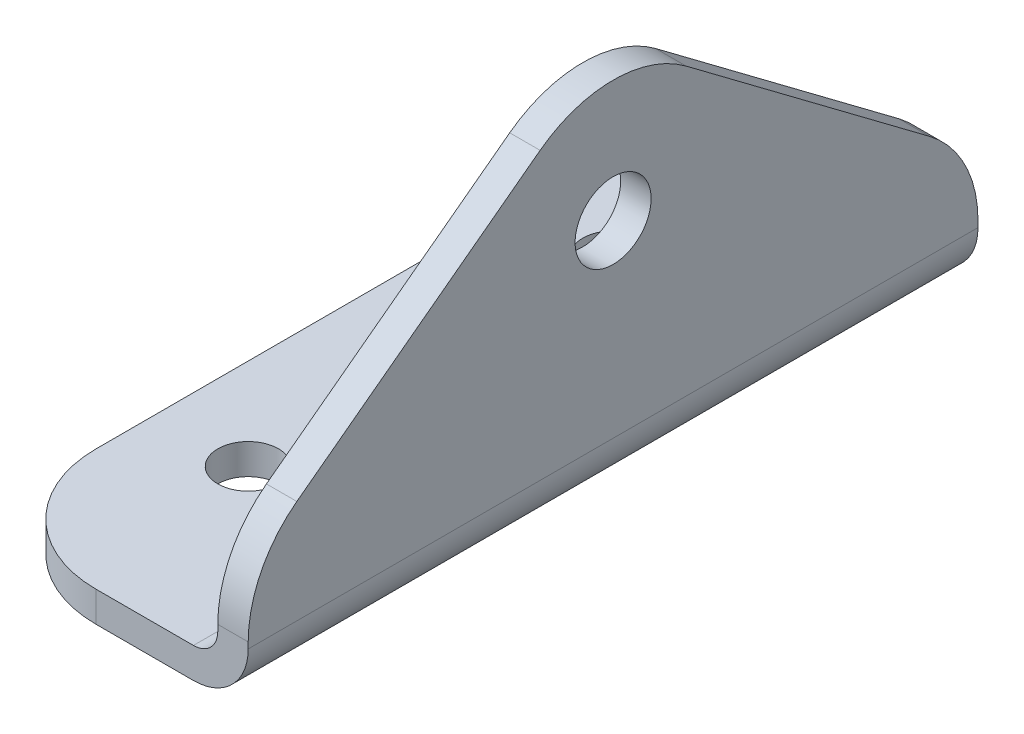
ISO-10303-21;
HEADER;
FILE_DESCRIPTION(('STEP AP214'),'2;1');
FILE_NAME('part.step','',(''),(''),'','','');
FILE_SCHEMA(('AUTOMOTIVE_DESIGN { 1 0 10303 214 1 1 1 1 }'));
ENDSEC;
DATA;
#1=APPLICATION_CONTEXT('core data for automotive mechanical design processes');
#2=APPLICATION_PROTOCOL_DEFINITION('international standard','automotive_design',2000,#1);
#3=PRODUCT_CONTEXT('',#1,'mechanical');
#4=PRODUCT('Part','Part','',(#3));
#5=PRODUCT_RELATED_PRODUCT_CATEGORY('part','',(#4));
#6=PRODUCT_DEFINITION_FORMATION('','',#4);
#7=PRODUCT_DEFINITION_CONTEXT('part definition',#1,'design');
#8=PRODUCT_DEFINITION('design','',#6,#7);
#9=PRODUCT_DEFINITION_SHAPE('','',#8);
#10=(LENGTH_UNIT() NAMED_UNIT(*) SI_UNIT(.MILLI.,.METRE.));
#11=(NAMED_UNIT(*) PLANE_ANGLE_UNIT() SI_UNIT($,.RADIAN.));
#12=(NAMED_UNIT(*) SI_UNIT($,.STERADIAN.) SOLID_ANGLE_UNIT());
#13=UNCERTAINTY_MEASURE_WITH_UNIT(LENGTH_MEASURE(1.E-05),#10,'distance_accuracy_value','');
#14=(GEOMETRIC_REPRESENTATION_CONTEXT(3) GLOBAL_UNCERTAINTY_ASSIGNED_CONTEXT((#13)) GLOBAL_UNIT_ASSIGNED_CONTEXT((#10,
#11,#12)) REPRESENTATION_CONTEXT('',''));
#15=CARTESIAN_POINT('',(0.,0.,0.));
#16=DIRECTION('',(0.,0.,1.));
#17=DIRECTION('',(1.,0.,0.));
#18=AXIS2_PLACEMENT_3D('',#15,#16,#17);
#19=CARTESIAN_POINT('',(19.05,25.4,19.05));
#20=DIRECTION('',(1.,0.,0.));
#21=DIRECTION('',(0.,0.,-1.));
#22=AXIS2_PLACEMENT_3D('',#19,#20,#21);
#23=CYLINDRICAL_SURFACE('',#22,12.7);
#24=DIRECTION('',(1.,0.,0.));
#25=VECTOR('',#24,1.);
#26=CARTESIAN_POINT('',(19.05,35.56,26.67));
#27=LINE('',#26,#25);
#28=CARTESIAN_POINT('',(19.05,35.56,26.67));
#29=VERTEX_POINT('',#28);
#30=CARTESIAN_POINT('',(15.875,35.56,26.67));
#31=VERTEX_POINT('',#30);
#32=EDGE_CURVE('E122',#29,#31,#27,.F.);
#33=ORIENTED_EDGE('',*,*,#32,.F.);
#34=CARTESIAN_POINT('',(19.05,25.4,19.05));
#35=DIRECTION('',(1.,0.,0.));
#36=DIRECTION('',(0.,0.,-1.));
#37=AXIS2_PLACEMENT_3D('',#34,#35,#36);
#38=CIRCLE('',#37,12.7);
#39=CARTESIAN_POINT('',(19.05,35.56,11.43));
#40=VERTEX_POINT('',#39);
#41=EDGE_CURVE('E207',#40,#29,#38,.T.);
#42=ORIENTED_EDGE('',*,*,#41,.F.);
#43=DIRECTION('',(1.,0.,0.));
#44=VECTOR('',#43,1.);
#45=CARTESIAN_POINT('',(19.05,35.56,11.43));
#46=LINE('',#45,#44);
#47=CARTESIAN_POINT('',(15.875,35.56,11.43));
#48=VERTEX_POINT('',#47);
#49=EDGE_CURVE('E115',#48,#40,#46,.T.);
#50=ORIENTED_EDGE('',*,*,#49,.F.);
#51=CARTESIAN_POINT('',(15.875,25.4,19.05));
#52=DIRECTION('',(1.,0.,0.));
#53=DIRECTION('',(0.,0.,-1.));
#54=AXIS2_PLACEMENT_3D('',#51,#52,#53);
#55=CIRCLE('',#54,12.7);
#56=EDGE_CURVE('E19',#48,#31,#55,.T.);
#57=ORIENTED_EDGE('',*,*,#56,.T.);
#58=EDGE_LOOP('',(#33,#42,#50,#57));
#59=FACE_BOUND('',#58,.T.);
#60=ADVANCED_FACE('F16',(#59),#23,.T.);
#61=CARTESIAN_POINT('',(19.05,35.56,26.67));
#62=DIRECTION('',(0.,0.8,0.6));
#63=DIRECTION('',(0.,-0.6,0.8));
#64=AXIS2_PLACEMENT_3D('',#61,#62,#63);
#65=PLANE('',#64);
#66=DIRECTION('',(0.,-0.6,0.8));
#67=VECTOR('',#66,1.);
#68=CARTESIAN_POINT('',(15.875,35.56,26.67));
#69=LINE('',#68,#67);
#70=CARTESIAN_POINT('',(15.875,16.51,52.07));
#71=VERTEX_POINT('',#70);
#72=EDGE_CURVE('E126',#31,#71,#69,.T.);
#73=ORIENTED_EDGE('',*,*,#72,.T.);
#74=DIRECTION('',(-1.,0.,0.));
#75=VECTOR('',#74,1.);
#76=CARTESIAN_POINT('',(68.71716,16.51,52.07));
#77=LINE('',#76,#75);
#78=CARTESIAN_POINT('',(19.05,16.51,52.07));
#79=VERTEX_POINT('',#78);
#80=EDGE_CURVE('E156',#79,#71,#77,.T.);
#81=ORIENTED_EDGE('',*,*,#80,.F.);
#82=DIRECTION('',(0.,-0.6,0.8));
#83=VECTOR('',#82,1.);
#84=CARTESIAN_POINT('',(19.05,35.56,26.67));
#85=LINE('',#84,#83);
#86=EDGE_CURVE('E128',#29,#79,#85,.T.);
#87=ORIENTED_EDGE('',*,*,#86,.F.);
#88=ORIENTED_EDGE('',*,*,#32,.T.);
#89=EDGE_LOOP('',(#73,#81,#87,#88));
#90=FACE_BOUND('',#89,.T.);
#91=ADVANCED_FACE('F124',(#90),#65,.T.);
#92=CARTESIAN_POINT('',(19.05,25.4,19.05));
#93=DIRECTION('',(1.,0.,0.));
#94=DIRECTION('',(0.,0.,-1.));
#95=AXIS2_PLACEMENT_3D('',#92,#93,#94);
#96=CYLINDRICAL_SURFACE('',#95,3.96875);
#97=CARTESIAN_POINT('',(15.875,25.4,19.05));
#98=DIRECTION('',(1.,0.,0.));
#99=DIRECTION('',(0.,0.,-1.));
#100=AXIS2_PLACEMENT_3D('',#97,#98,#99);
#101=CIRCLE('',#100,3.96875);
#102=CARTESIAN_POINT('',(15.875,25.4,15.08125));
#103=VERTEX_POINT('',#102);
#104=EDGE_CURVE('E135',#103,#103,#101,.F.);
#105=ORIENTED_EDGE('',*,*,#104,.T.);
#106=EDGE_LOOP('',(#105));
#107=FACE_BOUND('',#106,.T.);
#108=CARTESIAN_POINT('',(19.05,25.4,19.05));
#109=DIRECTION('',(1.,0.,0.));
#110=DIRECTION('',(0.,0.,-1.));
#111=AXIS2_PLACEMENT_3D('',#108,#109,#110);
#112=CIRCLE('',#111,3.96875);
#113=CARTESIAN_POINT('',(19.05,25.4,15.08125));
#114=VERTEX_POINT('',#113);
#115=EDGE_CURVE('E202',#114,#114,#112,.F.);
#116=ORIENTED_EDGE('',*,*,#115,.F.);
#117=EDGE_LOOP('',(#116));
#118=FACE_BOUND('',#117,.T.);
#119=ADVANCED_FACE('F214',(#107,#118),#96,.F.);
#120=CARTESIAN_POINT('',(19.05,12.7,-19.05));
#121=DIRECTION('',(0.,0.8,-0.6));
#122=DIRECTION('',(0.,0.6,0.8));
#123=AXIS2_PLACEMENT_3D('',#120,#121,#122);
#124=PLANE('',#123);
#125=DIRECTION('',(0.,0.6,0.8));
#126=VECTOR('',#125,1.);
#127=CARTESIAN_POINT('',(19.05,16.51,-13.97));
#128=LINE('',#127,#126);
#129=CARTESIAN_POINT('',(19.05,16.51,-13.97));
#130=VERTEX_POINT('',#129);
#131=EDGE_CURVE('E209',#130,#40,#128,.T.);
#132=ORIENTED_EDGE('',*,*,#131,.F.);
#133=DIRECTION('',(-1.,0.,0.));
#134=VECTOR('',#133,1.);
#135=CARTESIAN_POINT('',(68.71716,16.51,-13.97));
#136=LINE('',#135,#134);
#137=CARTESIAN_POINT('',(15.875,16.51,-13.97));
#138=VERTEX_POINT('',#137);
#139=EDGE_CURVE('E152',#138,#130,#136,.F.);
#140=ORIENTED_EDGE('',*,*,#139,.F.);
#141=DIRECTION('',(0.,0.6,0.8));
#142=VECTOR('',#141,1.);
#143=CARTESIAN_POINT('',(15.875,16.51,-13.97));
#144=LINE('',#143,#142);
#145=EDGE_CURVE('E137',#138,#48,#144,.T.);
#146=ORIENTED_EDGE('',*,*,#145,.T.);
#147=ORIENTED_EDGE('',*,*,#49,.T.);
#148=EDGE_LOOP('',(#132,#140,#146,#147));
#149=FACE_BOUND('',#148,.T.);
#150=ADVANCED_FACE('F219',(#149),#124,.T.);
#151=CARTESIAN_POINT('',(15.875,0.,0.));
#152=DIRECTION('',(1.,0.,0.));
#153=DIRECTION('',(0.,0.,-1.));
#154=AXIS2_PLACEMENT_3D('',#151,#152,#153);
#155=PLANE('',#154);
#156=ORIENTED_EDGE('',*,*,#104,.F.);
#157=EDGE_LOOP('',(#156));
#158=FACE_BOUND('',#157,.T.);
#159=ORIENTED_EDGE('',*,*,#56,.F.);
#160=ORIENTED_EDGE('',*,*,#145,.F.);
#161=CARTESIAN_POINT('',(15.875,6.35,-6.35));
#162=DIRECTION('',(-1.,0.,0.));
#163=DIRECTION('',(0.,0.,1.));
#164=AXIS2_PLACEMENT_3D('',#161,#162,#163);
#165=CIRCLE('',#164,12.7);
#166=CARTESIAN_POINT('',(15.875,6.35,-19.05));
#167=VERTEX_POINT('',#166);
#168=EDGE_CURVE('E197',#167,#138,#165,.F.);
#169=ORIENTED_EDGE('',*,*,#168,.F.);
#170=DIRECTION('',(0.,1.,0.));
#171=VECTOR('',#170,1.);
#172=CARTESIAN_POINT('',(15.875,0.,-19.05));
#173=LINE('',#172,#171);
#174=CARTESIAN_POINT('',(15.875,5.715,-19.05));
#175=VERTEX_POINT('',#174);
#176=EDGE_CURVE('E138',#175,#167,#173,.T.);
#177=ORIENTED_EDGE('',*,*,#176,.F.);
#178=DIRECTION('',(0.,0.,1.));
#179=VECTOR('',#178,1.);
#180=CARTESIAN_POINT('',(15.875,5.715,-118.38432));
#181=LINE('',#180,#179);
#182=CARTESIAN_POINT('',(15.875,5.715,57.15));
#183=VERTEX_POINT('',#182);
#184=EDGE_CURVE('E155',#175,#183,#181,.T.);
#185=ORIENTED_EDGE('',*,*,#184,.T.);
#186=DIRECTION('',(0.,1.,0.));
#187=VECTOR('',#186,1.);
#188=CARTESIAN_POINT('',(15.875,0.,57.15));
#189=LINE('',#188,#187);
#190=CARTESIAN_POINT('',(15.875,6.35,57.15));
#191=VERTEX_POINT('',#190);
#192=EDGE_CURVE('E142',#191,#183,#189,.F.);
#193=ORIENTED_EDGE('',*,*,#192,.F.);
#194=CARTESIAN_POINT('',(15.875,6.35,44.45));
#195=DIRECTION('',(-1.,0.,0.));
#196=DIRECTION('',(0.,0.,1.));
#197=AXIS2_PLACEMENT_3D('',#194,#195,#196);
#198=CIRCLE('',#197,12.7);
#199=EDGE_CURVE('E134',#71,#191,#198,.F.);
#200=ORIENTED_EDGE('',*,*,#199,.F.);
#201=ORIENTED_EDGE('',*,*,#72,.F.);
#202=EDGE_LOOP('',(#159,#160,#169,#177,#185,#193,#200,#201));
#203=FACE_BOUND('',#202,.T.);
#204=ADVANCED_FACE('F131',(#158,#203),#155,.F.);
#205=CARTESIAN_POINT('',(68.71716,6.35,44.45));
#206=DIRECTION('',(-1.,0.,0.));
#207=DIRECTION('',(0.,0.,1.));
#208=AXIS2_PLACEMENT_3D('',#205,#206,#207);
#209=CYLINDRICAL_SURFACE('',#208,12.7);
#210=ORIENTED_EDGE('',*,*,#80,.T.);
#211=ORIENTED_EDGE('',*,*,#199,.T.);
#212=DIRECTION('',(1.,0.,0.));
#213=VECTOR('',#212,1.);
#214=CARTESIAN_POINT('',(0.,6.35,57.15));
#215=LINE('',#214,#213);
#216=CARTESIAN_POINT('',(19.05,6.35,57.15));
#217=VERTEX_POINT('',#216);
#218=EDGE_CURVE('E192',#217,#191,#215,.F.);
#219=ORIENTED_EDGE('',*,*,#218,.F.);
#220=CARTESIAN_POINT('',(19.05,6.35,44.45));
#221=DIRECTION('',(-1.,0.,0.));
#222=DIRECTION('',(0.,0.,1.));
#223=AXIS2_PLACEMENT_3D('',#220,#221,#222);
#224=CIRCLE('',#223,12.7);
#225=EDGE_CURVE('E205',#79,#217,#224,.F.);
#226=ORIENTED_EDGE('',*,*,#225,.F.);
#227=EDGE_LOOP('',(#210,#211,#219,#226));
#228=FACE_BOUND('',#227,.T.);
#229=ADVANCED_FACE('F218',(#228),#209,.T.);
#230=CARTESIAN_POINT('',(19.05,0.,57.15));
#231=DIRECTION('',(1.,0.,0.));
#232=DIRECTION('',(0.,0.,-1.));
#233=AXIS2_PLACEMENT_3D('',#230,#231,#232);
#234=PLANE('',#233);
#235=ORIENTED_EDGE('',*,*,#115,.T.);
#236=EDGE_LOOP('',(#235));
#237=FACE_BOUND('',#236,.T.);
#238=DIRECTION('',(0.,1.,0.));
#239=VECTOR('',#238,1.);
#240=CARTESIAN_POINT('',(19.05,0.,57.15));
#241=LINE('',#240,#239);
#242=CARTESIAN_POINT('',(19.05,5.715,57.15));
#243=VERTEX_POINT('',#242);
#244=EDGE_CURVE('E195',#243,#217,#241,.T.);
#245=ORIENTED_EDGE('',*,*,#244,.F.);
#246=DIRECTION('',(0.,0.,1.));
#247=VECTOR('',#246,1.);
#248=CARTESIAN_POINT('',(19.05,5.715,-118.38432));
#249=LINE('',#248,#247);
#250=CARTESIAN_POINT('',(19.05,5.715,-19.05));
#251=VERTEX_POINT('',#250);
#252=EDGE_CURVE('E188',#251,#243,#249,.T.);
#253=ORIENTED_EDGE('',*,*,#252,.F.);
#254=DIRECTION('',(0.,1.,0.));
#255=VECTOR('',#254,1.);
#256=CARTESIAN_POINT('',(19.05,0.,-19.05));
#257=LINE('',#256,#255);
#258=CARTESIAN_POINT('',(19.05,6.35,-19.05));
#259=VERTEX_POINT('',#258);
#260=EDGE_CURVE('E210',#251,#259,#257,.T.);
#261=ORIENTED_EDGE('',*,*,#260,.T.);
#262=CARTESIAN_POINT('',(19.05,6.35,-6.35));
#263=DIRECTION('',(-1.,0.,0.));
#264=DIRECTION('',(0.,0.,1.));
#265=AXIS2_PLACEMENT_3D('',#262,#263,#264);
#266=CIRCLE('',#265,12.7);
#267=EDGE_CURVE('E154',#130,#259,#266,.T.);
#268=ORIENTED_EDGE('',*,*,#267,.F.);
#269=ORIENTED_EDGE('',*,*,#131,.T.);
#270=ORIENTED_EDGE('',*,*,#41,.T.);
#271=ORIENTED_EDGE('',*,*,#86,.T.);
#272=ORIENTED_EDGE('',*,*,#225,.T.);
#273=EDGE_LOOP('',(#245,#253,#261,#268,#269,#270,#271,#272));
#274=FACE_BOUND('',#273,.T.);
#275=ADVANCED_FACE('F226',(#237,#274),#234,.T.);
#276=CARTESIAN_POINT('',(13.335,5.715,-118.38432));
#277=DIRECTION('',(0.,0.,1.));
#278=DIRECTION('',(1.,0.,0.));
#279=AXIS2_PLACEMENT_3D('',#276,#277,#278);
#280=CYLINDRICAL_SURFACE('',#279,2.54);
#281=ORIENTED_EDGE('',*,*,#184,.F.);
#282=CARTESIAN_POINT('',(13.335,5.715,-19.05));
#283=DIRECTION('',(0.,0.,1.));
#284=DIRECTION('',(1.,0.,0.));
#285=AXIS2_PLACEMENT_3D('',#282,#283,#284);
#286=CIRCLE('',#285,2.54);
#287=CARTESIAN_POINT('',(13.335,3.175,-19.05));
#288=VERTEX_POINT('',#287);
#289=EDGE_CURVE('E151',#288,#175,#286,.T.);
#290=ORIENTED_EDGE('',*,*,#289,.F.);
#291=DIRECTION('',(0.,0.,1.));
#292=VECTOR('',#291,1.);
#293=CARTESIAN_POINT('',(13.335,3.175,0.));
#294=LINE('',#293,#292);
#295=CARTESIAN_POINT('',(13.335,3.175,57.15));
#296=VERTEX_POINT('',#295);
#297=EDGE_CURVE('E196',#296,#288,#294,.F.);
#298=ORIENTED_EDGE('',*,*,#297,.F.);
#299=CARTESIAN_POINT('',(13.335,5.715,57.15));
#300=DIRECTION('',(0.,0.,1.));
#301=DIRECTION('',(1.,0.,0.));
#302=AXIS2_PLACEMENT_3D('',#299,#300,#301);
#303=CIRCLE('',#302,2.54);
#304=EDGE_CURVE('E189',#183,#296,#303,.F.);
#305=ORIENTED_EDGE('',*,*,#304,.F.);
#306=EDGE_LOOP('',(#281,#290,#298,#305));
#307=FACE_BOUND('',#306,.T.);
#308=ADVANCED_FACE('F277',(#307),#280,.F.);
#309=CARTESIAN_POINT('',(68.71716,6.35,-6.35));
#310=DIRECTION('',(-1.,0.,0.));
#311=DIRECTION('',(0.,0.,1.));
#312=AXIS2_PLACEMENT_3D('',#309,#310,#311);
#313=CYLINDRICAL_SURFACE('',#312,12.7);
#314=DIRECTION('',(-1.,0.,0.));
#315=VECTOR('',#314,1.);
#316=CARTESIAN_POINT('',(19.05,6.35,-19.05));
#317=LINE('',#316,#315);
#318=EDGE_CURVE('E147',#167,#259,#317,.F.);
#319=ORIENTED_EDGE('',*,*,#318,.F.);
#320=ORIENTED_EDGE('',*,*,#168,.T.);
#321=ORIENTED_EDGE('',*,*,#139,.T.);
#322=ORIENTED_EDGE('',*,*,#267,.T.);
#323=EDGE_LOOP('',(#319,#320,#321,#322));
#324=FACE_BOUND('',#323,.T.);
#325=ADVANCED_FACE('F273',(#324),#313,.T.);
#326=CARTESIAN_POINT('',(0.,3.175,0.));
#327=DIRECTION('',(0.,1.,0.));
#328=DIRECTION('',(0.,0.,1.));
#329=AXIS2_PLACEMENT_3D('',#326,#327,#328);
#330=PLANE('',#329);
#331=CARTESIAN_POINT('',(0.,3.175,0.));
#332=DIRECTION('',(0.,1.,0.));
#333=DIRECTION('',(0.,0.,1.));
#334=AXIS2_PLACEMENT_3D('',#331,#332,#333);
#335=CIRCLE('',#334,3.175);
#336=CARTESIAN_POINT('',(0.,3.175,3.175));
#337=VERTEX_POINT('',#336);
#338=EDGE_CURVE('E170',#337,#337,#335,.F.);
#339=ORIENTED_EDGE('',*,*,#338,.T.);
#340=EDGE_LOOP('',(#339));
#341=FACE_BOUND('',#340,.T.);
#342=CARTESIAN_POINT('',(0.,3.175,38.1));
#343=DIRECTION('',(0.,1.,0.));
#344=DIRECTION('',(0.,0.,1.));
#345=AXIS2_PLACEMENT_3D('',#342,#343,#344);
#346=CIRCLE('',#345,3.175);
#347=CARTESIAN_POINT('',(0.,3.175,41.275));
#348=VERTEX_POINT('',#347);
#349=EDGE_CURVE('E173',#348,#348,#346,.F.);
#350=ORIENTED_EDGE('',*,*,#349,.T.);
#351=EDGE_LOOP('',(#350));
#352=FACE_BOUND('',#351,.T.);
#353=DIRECTION('',(0.,0.,-1.));
#354=VECTOR('',#353,1.);
#355=CARTESIAN_POINT('',(-9.525,3.175,57.15));
#356=LINE('',#355,#354);
#357=CARTESIAN_POINT('',(-9.525,3.175,-6.35));
#358=VERTEX_POINT('',#357);
#359=CARTESIAN_POINT('',(-9.525,3.175,44.45));
#360=VERTEX_POINT('',#359);
#361=EDGE_CURVE('E176',#358,#360,#356,.F.);
#362=ORIENTED_EDGE('',*,*,#361,.T.);
#363=CARTESIAN_POINT('',(3.175,3.175,44.45));
#364=DIRECTION('',(0.,-1.,0.));
#365=DIRECTION('',(0.,0.,-1.));
#366=AXIS2_PLACEMENT_3D('',#363,#364,#365);
#367=CIRCLE('',#366,12.7);
#368=CARTESIAN_POINT('',(3.175,3.175,57.15));
#369=VERTEX_POINT('',#368);
#370=EDGE_CURVE('E193',#369,#360,#367,.T.);
#371=ORIENTED_EDGE('',*,*,#370,.F.);
#372=DIRECTION('',(1.,0.,0.));
#373=VECTOR('',#372,1.);
#374=CARTESIAN_POINT('',(0.,3.175,57.15));
#375=LINE('',#374,#373);
#376=EDGE_CURVE('E191',#296,#369,#375,.F.);
#377=ORIENTED_EDGE('',*,*,#376,.F.);
#378=ORIENTED_EDGE('',*,*,#297,.T.);
#379=DIRECTION('',(-1.,0.,0.));
#380=VECTOR('',#379,1.);
#381=CARTESIAN_POINT('',(19.05,3.175,-19.05));
#382=LINE('',#381,#380);
#383=CARTESIAN_POINT('',(3.175,3.175,-19.05));
#384=VERTEX_POINT('',#383);
#385=EDGE_CURVE('E185',#384,#288,#382,.F.);
#386=ORIENTED_EDGE('',*,*,#385,.F.);
#387=CARTESIAN_POINT('',(3.175,3.175,-6.35));
#388=DIRECTION('',(0.,1.,0.));
#389=DIRECTION('',(0.,0.,1.));
#390=AXIS2_PLACEMENT_3D('',#387,#388,#389);
#391=CIRCLE('',#390,12.7);
#392=EDGE_CURVE('E177',#358,#384,#391,.F.);
#393=ORIENTED_EDGE('',*,*,#392,.F.);
#394=EDGE_LOOP('',(#362,#371,#377,#378,#386,#393));
#395=FACE_BOUND('',#394,.T.);
#396=ADVANCED_FACE('F269',(#341,#352,#395),#330,.T.);
#397=CARTESIAN_POINT('',(3.175,87.8032037232896,44.45));
#398=DIRECTION('',(0.,-1.,0.));
#399=DIRECTION('',(0.,0.,-1.));
#400=AXIS2_PLACEMENT_3D('',#397,#398,#399);
#401=CYLINDRICAL_SURFACE('',#400,12.7);
#402=DIRECTION('',(0.,1.,0.));
#403=VECTOR('',#402,1.);
#404=CARTESIAN_POINT('',(-9.525,3.175,44.45));
#405=LINE('',#404,#403);
#406=CARTESIAN_POINT('',(-9.525,0.,44.45));
#407=VERTEX_POINT('',#406);
#408=EDGE_CURVE('E180',#360,#407,#405,.F.);
#409=ORIENTED_EDGE('',*,*,#408,.T.);
#410=CARTESIAN_POINT('',(3.175,0.,44.45));
#411=DIRECTION('',(0.,-1.,0.));
#412=DIRECTION('',(0.,0.,-1.));
#413=AXIS2_PLACEMENT_3D('',#410,#411,#412);
#414=CIRCLE('',#413,12.7);
#415=CARTESIAN_POINT('',(3.175,0.,57.15));
#416=VERTEX_POINT('',#415);
#417=EDGE_CURVE('E166',#407,#416,#414,.F.);
#418=ORIENTED_EDGE('',*,*,#417,.T.);
#419=DIRECTION('',(0.,1.,0.));
#420=VECTOR('',#419,1.);
#421=CARTESIAN_POINT('',(3.175,0.,57.15));
#422=LINE('',#421,#420);
#423=EDGE_CURVE('E312',#369,#416,#422,.F.);
#424=ORIENTED_EDGE('',*,*,#423,.F.);
#425=ORIENTED_EDGE('',*,*,#370,.T.);
#426=EDGE_LOOP('',(#409,#418,#424,#425));
#427=FACE_BOUND('',#426,.T.);
#428=ADVANCED_FACE('F265',(#427),#401,.T.);
#429=CARTESIAN_POINT('',(0.,0.,57.15));
#430=DIRECTION('',(0.,0.,1.));
#431=DIRECTION('',(1.,0.,0.));
#432=AXIS2_PLACEMENT_3D('',#429,#430,#431);
#433=PLANE('',#432);
#434=ORIENTED_EDGE('',*,*,#376,.T.);
#435=ORIENTED_EDGE('',*,*,#423,.T.);
#436=DIRECTION('',(1.,0.,0.));
#437=VECTOR('',#436,1.);
#438=CARTESIAN_POINT('',(0.,0.,57.15));
#439=LINE('',#438,#437);
#440=CARTESIAN_POINT('',(13.335,0.,57.15));
#441=VERTEX_POINT('',#440);
#442=EDGE_CURVE('E169',#416,#441,#439,.T.);
#443=ORIENTED_EDGE('',*,*,#442,.T.);
#444=CARTESIAN_POINT('',(13.335,5.715,57.15));
#445=DIRECTION('',(0.,0.,1.));
#446=DIRECTION('',(1.,0.,0.));
#447=AXIS2_PLACEMENT_3D('',#444,#445,#446);
#448=CIRCLE('',#447,5.715);
#449=EDGE_CURVE('E186',#243,#441,#448,.F.);
#450=ORIENTED_EDGE('',*,*,#449,.F.);
#451=ORIENTED_EDGE('',*,*,#244,.T.);
#452=ORIENTED_EDGE('',*,*,#218,.T.);
#453=ORIENTED_EDGE('',*,*,#192,.T.);
#454=ORIENTED_EDGE('',*,*,#304,.T.);
#455=EDGE_LOOP('',(#434,#435,#443,#450,#451,#452,#453,#454));
#456=FACE_BOUND('',#455,.T.);
#457=ADVANCED_FACE('F261',(#456),#433,.T.);
#458=CARTESIAN_POINT('',(13.335,5.715,-118.38432));
#459=DIRECTION('',(0.,0.,1.));
#460=DIRECTION('',(1.,0.,0.));
#461=AXIS2_PLACEMENT_3D('',#458,#459,#460);
#462=CYLINDRICAL_SURFACE('',#461,5.715);
#463=ORIENTED_EDGE('',*,*,#252,.T.);
#464=ORIENTED_EDGE('',*,*,#449,.T.);
#465=DIRECTION('',(0.,0.,1.));
#466=VECTOR('',#465,1.);
#467=CARTESIAN_POINT('',(13.335,0.,0.));
#468=LINE('',#467,#466);
#469=CARTESIAN_POINT('',(13.335,0.,-19.05));
#470=VERTEX_POINT('',#469);
#471=EDGE_CURVE('E301',#441,#470,#468,.F.);
#472=ORIENTED_EDGE('',*,*,#471,.T.);
#473=CARTESIAN_POINT('',(13.335,5.715,-19.05));
#474=DIRECTION('',(0.,0.,1.));
#475=DIRECTION('',(1.,0.,0.));
#476=AXIS2_PLACEMENT_3D('',#473,#474,#475);
#477=CIRCLE('',#476,5.715);
#478=EDGE_CURVE('E150',#251,#470,#477,.F.);
#479=ORIENTED_EDGE('',*,*,#478,.F.);
#480=EDGE_LOOP('',(#463,#464,#472,#479));
#481=FACE_BOUND('',#480,.T.);
#482=ADVANCED_FACE('F257',(#481),#462,.T.);
#483=CARTESIAN_POINT('',(19.05,0.,-19.05));
#484=DIRECTION('',(0.,0.,-1.));
#485=DIRECTION('',(-1.,0.,0.));
#486=AXIS2_PLACEMENT_3D('',#483,#484,#485);
#487=PLANE('',#486);
#488=DIRECTION('',(1.,0.,0.));
#489=VECTOR('',#488,1.);
#490=CARTESIAN_POINT('',(0.,0.,-19.05));
#491=LINE('',#490,#489);
#492=CARTESIAN_POINT('',(3.175,0.,-19.05));
#493=VERTEX_POINT('',#492);
#494=EDGE_CURVE('E165',#470,#493,#491,.F.);
#495=ORIENTED_EDGE('',*,*,#494,.T.);
#496=DIRECTION('',(0.,1.,0.));
#497=VECTOR('',#496,1.);
#498=CARTESIAN_POINT('',(3.175,-49.6875570297164,-19.05));
#499=LINE('',#498,#497);
#500=EDGE_CURVE('E181',#384,#493,#499,.F.);
#501=ORIENTED_EDGE('',*,*,#500,.F.);
#502=ORIENTED_EDGE('',*,*,#385,.T.);
#503=ORIENTED_EDGE('',*,*,#289,.T.);
#504=ORIENTED_EDGE('',*,*,#176,.T.);
#505=ORIENTED_EDGE('',*,*,#318,.T.);
#506=ORIENTED_EDGE('',*,*,#260,.F.);
#507=ORIENTED_EDGE('',*,*,#478,.T.);
#508=EDGE_LOOP('',(#495,#501,#502,#503,#504,#505,#506,#507));
#509=FACE_BOUND('',#508,.T.);
#510=ADVANCED_FACE('F253',(#509),#487,.T.);
#511=CARTESIAN_POINT('',(3.175,-49.6875570297164,-6.35));
#512=DIRECTION('',(0.,1.,0.));
#513=DIRECTION('',(0.,0.,1.));
#514=AXIS2_PLACEMENT_3D('',#511,#512,#513);
#515=CYLINDRICAL_SURFACE('',#514,12.7);
#516=DIRECTION('',(0.,1.,0.));
#517=VECTOR('',#516,1.);
#518=CARTESIAN_POINT('',(-9.525,3.175,-6.35));
#519=LINE('',#518,#517);
#520=CARTESIAN_POINT('',(-9.525,0.,-6.35));
#521=VERTEX_POINT('',#520);
#522=EDGE_CURVE('E34',#521,#358,#519,.T.);
#523=ORIENTED_EDGE('',*,*,#522,.T.);
#524=ORIENTED_EDGE('',*,*,#392,.T.);
#525=ORIENTED_EDGE('',*,*,#500,.T.);
#526=CARTESIAN_POINT('',(3.175,0.,-6.35));
#527=DIRECTION('',(0.,1.,0.));
#528=DIRECTION('',(0.,0.,1.));
#529=AXIS2_PLACEMENT_3D('',#526,#527,#528);
#530=CIRCLE('',#529,12.7);
#531=EDGE_CURVE('E162',#493,#521,#530,.T.);
#532=ORIENTED_EDGE('',*,*,#531,.T.);
#533=EDGE_LOOP('',(#523,#524,#525,#532));
#534=FACE_BOUND('',#533,.T.);
#535=ADVANCED_FACE('F250',(#534),#515,.T.);
#536=CARTESIAN_POINT('',(-9.525,3.175,57.15));
#537=DIRECTION('',(1.,0.,0.));
#538=DIRECTION('',(0.,0.,-1.));
#539=AXIS2_PLACEMENT_3D('',#536,#537,#538);
#540=PLANE('',#539);
#541=ORIENTED_EDGE('',*,*,#522,.F.);
#542=DIRECTION('',(0.,0.,1.));
#543=VECTOR('',#542,1.);
#544=CARTESIAN_POINT('',(-9.525,0.,0.));
#545=LINE('',#544,#543);
#546=EDGE_CURVE('E161',#521,#407,#545,.T.);
#547=ORIENTED_EDGE('',*,*,#546,.T.);
#548=ORIENTED_EDGE('',*,*,#408,.F.);
#549=ORIENTED_EDGE('',*,*,#361,.F.);
#550=EDGE_LOOP('',(#541,#547,#548,#549));
#551=FACE_BOUND('',#550,.T.);
#552=ADVANCED_FACE('F246',(#551),#540,.F.);
#553=CARTESIAN_POINT('',(0.,0.,38.1));
#554=DIRECTION('',(0.,1.,0.));
#555=DIRECTION('',(0.,0.,1.));
#556=AXIS2_PLACEMENT_3D('',#553,#554,#555);
#557=CYLINDRICAL_SURFACE('',#556,3.175);
#558=ORIENTED_EDGE('',*,*,#349,.F.);
#559=EDGE_LOOP('',(#558));
#560=FACE_BOUND('',#559,.T.);
#561=CARTESIAN_POINT('',(0.,0.,38.1));
#562=DIRECTION('',(0.,1.,0.));
#563=DIRECTION('',(0.,0.,1.));
#564=AXIS2_PLACEMENT_3D('',#561,#562,#563);
#565=CIRCLE('',#564,3.175);
#566=CARTESIAN_POINT('',(0.,0.,41.275));
#567=VERTEX_POINT('',#566);
#568=EDGE_CURVE('E25',#567,#567,#565,.F.);
#569=ORIENTED_EDGE('',*,*,#568,.T.);
#570=EDGE_LOOP('',(#569));
#571=FACE_BOUND('',#570,.T.);
#572=ADVANCED_FACE('F238',(#560,#571),#557,.F.);
#573=CARTESIAN_POINT('',(0.,0.,0.));
#574=DIRECTION('',(0.,1.,0.));
#575=DIRECTION('',(0.,0.,1.));
#576=AXIS2_PLACEMENT_3D('',#573,#574,#575);
#577=CYLINDRICAL_SURFACE('',#576,3.175);
#578=ORIENTED_EDGE('',*,*,#338,.F.);
#579=EDGE_LOOP('',(#578));
#580=FACE_BOUND('',#579,.T.);
#581=CARTESIAN_POINT('',(0.,0.,0.));
#582=DIRECTION('',(0.,1.,0.));
#583=DIRECTION('',(0.,0.,1.));
#584=AXIS2_PLACEMENT_3D('',#581,#582,#583);
#585=CIRCLE('',#584,3.175);
#586=CARTESIAN_POINT('',(0.,0.,3.175));
#587=VERTEX_POINT('',#586);
#588=EDGE_CURVE('E11',#587,#587,#585,.F.);
#589=ORIENTED_EDGE('',*,*,#588,.T.);
#590=EDGE_LOOP('',(#589));
#591=FACE_BOUND('',#590,.T.);
#592=ADVANCED_FACE('F232',(#580,#591),#577,.F.);
#593=CARTESIAN_POINT('',(0.,0.,0.));
#594=DIRECTION('',(0.,1.,0.));
#595=DIRECTION('',(0.,0.,1.));
#596=AXIS2_PLACEMENT_3D('',#593,#594,#595);
#597=PLANE('',#596);
#598=ORIENTED_EDGE('',*,*,#588,.F.);
#599=EDGE_LOOP('',(#598));
#600=FACE_BOUND('',#599,.T.);
#601=ORIENTED_EDGE('',*,*,#568,.F.);
#602=EDGE_LOOP('',(#601));
#603=FACE_BOUND('',#602,.T.);
#604=ORIENTED_EDGE('',*,*,#531,.F.);
#605=ORIENTED_EDGE('',*,*,#494,.F.);
#606=ORIENTED_EDGE('',*,*,#471,.F.);
#607=ORIENTED_EDGE('',*,*,#442,.F.);
#608=ORIENTED_EDGE('',*,*,#417,.F.);
#609=ORIENTED_EDGE('',*,*,#546,.F.);
#610=EDGE_LOOP('',(#604,#605,#606,#607,#608,#609));
#611=FACE_BOUND('',#610,.T.);
#612=ADVANCED_FACE('F230',(#600,#603,#611),#597,.F.);
#613=CLOSED_SHELL('',(#60,#91,#119,#150,#204,#229,#275,#308,#325,#396,#428,#457,#482,#510,#535,
#552,#572,#592,#612));
#614=MANIFOLD_SOLID_BREP('B1',#613);
#615=ADVANCED_BREP_SHAPE_REPRESENTATION('',(#18,#614),#14);
#616=SHAPE_DEFINITION_REPRESENTATION(#9,#615);
ENDSEC;
END-ISO-10303-21;
